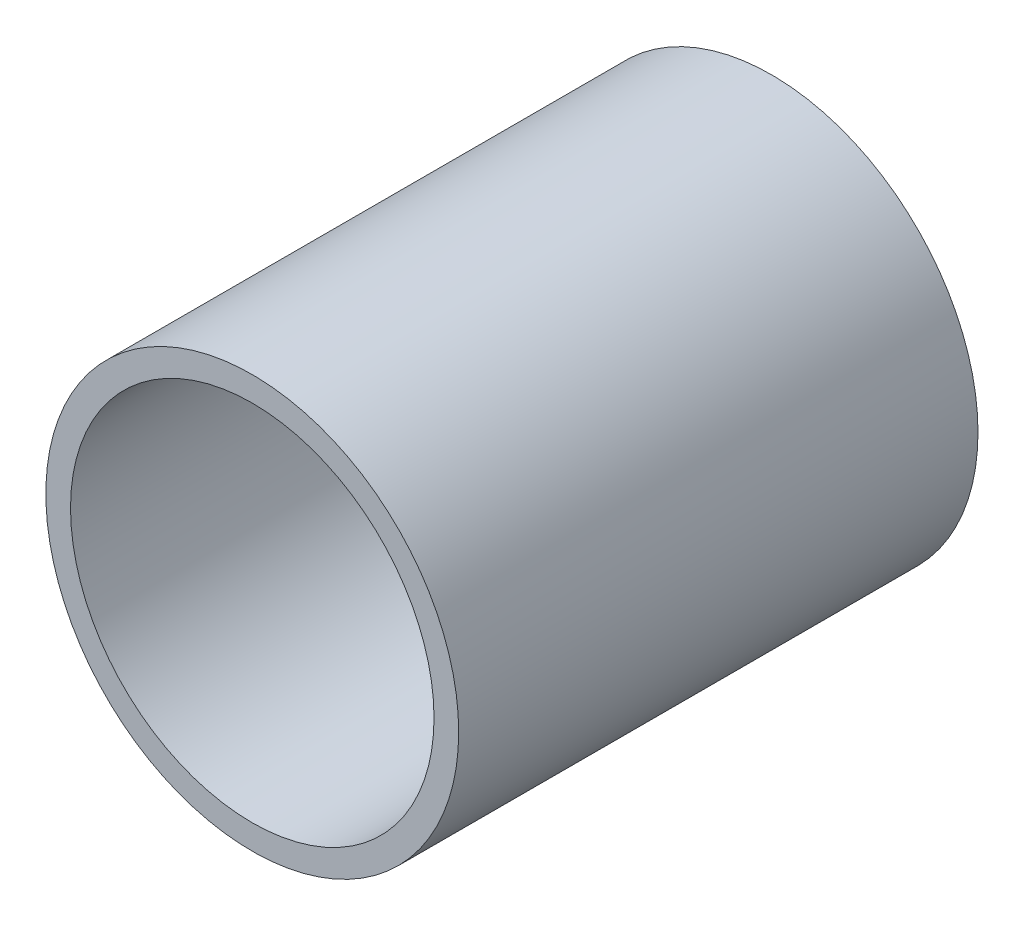
ISO-10303-21;
HEADER;
FILE_DESCRIPTION(('STEP AP214'),'2;1');
FILE_NAME('part.step','',(''),(''),'','','');
FILE_SCHEMA(('AUTOMOTIVE_DESIGN { 1 0 10303 214 1 1 1 1 }'));
ENDSEC;
DATA;
#1=APPLICATION_CONTEXT('core data for automotive mechanical design processes');
#2=APPLICATION_PROTOCOL_DEFINITION('international standard','automotive_design',2000,#1);
#3=PRODUCT_CONTEXT('',#1,'mechanical');
#4=PRODUCT('Part','Part','',(#3));
#5=PRODUCT_RELATED_PRODUCT_CATEGORY('part','',(#4));
#6=PRODUCT_DEFINITION_FORMATION('','',#4);
#7=PRODUCT_DEFINITION_CONTEXT('part definition',#1,'design');
#8=PRODUCT_DEFINITION('design','',#6,#7);
#9=PRODUCT_DEFINITION_SHAPE('','',#8);
#10=(LENGTH_UNIT() NAMED_UNIT(*) SI_UNIT(.MILLI.,.METRE.));
#11=(NAMED_UNIT(*) PLANE_ANGLE_UNIT() SI_UNIT($,.RADIAN.));
#12=(NAMED_UNIT(*) SI_UNIT($,.STERADIAN.) SOLID_ANGLE_UNIT());
#13=UNCERTAINTY_MEASURE_WITH_UNIT(LENGTH_MEASURE(1.E-05),#10,'distance_accuracy_value','');
#14=(GEOMETRIC_REPRESENTATION_CONTEXT(3) GLOBAL_UNCERTAINTY_ASSIGNED_CONTEXT((#13)) GLOBAL_UNIT_ASSIGNED_CONTEXT((#10,
#11,#12)) REPRESENTATION_CONTEXT('',''));
#15=CARTESIAN_POINT('',(0.,0.,0.));
#16=DIRECTION('',(0.,0.,1.));
#17=DIRECTION('',(1.,0.,0.));
#18=AXIS2_PLACEMENT_3D('',#15,#16,#17);
#19=CARTESIAN_POINT('',(0.,0.,20.));
#20=DIRECTION('',(0.,0.,1.));
#21=DIRECTION('',(1.,0.,0.));
#22=AXIS2_PLACEMENT_3D('',#19,#20,#21);
#23=PLANE('',#22);
#24=CARTESIAN_POINT('',(0.,0.,20.));
#25=DIRECTION('',(0.,0.,1.));
#26=DIRECTION('',(1.,0.,0.));
#27=AXIS2_PLACEMENT_3D('',#24,#25,#26);
#28=CIRCLE('',#27,7.95);
#29=CARTESIAN_POINT('',(7.95,0.,20.));
#30=VERTEX_POINT('',#29);
#31=EDGE_CURVE('E10',#30,#30,#28,.T.);
#32=ORIENTED_EDGE('',*,*,#31,.T.);
#33=EDGE_LOOP('',(#32));
#34=FACE_BOUND('',#33,.T.);
#35=CARTESIAN_POINT('',(0.,0.,20.));
#36=DIRECTION('',(0.,0.,1.));
#37=DIRECTION('',(1.,0.,0.));
#38=AXIS2_PLACEMENT_3D('',#35,#36,#37);
#39=CIRCLE('',#38,7.);
#40=CARTESIAN_POINT('',(7.,0.,20.));
#41=VERTEX_POINT('',#40);
#42=EDGE_CURVE('E41',#41,#41,#39,.T.);
#43=ORIENTED_EDGE('',*,*,#42,.F.);
#44=EDGE_LOOP('',(#43));
#45=FACE_BOUND('',#44,.T.);
#46=ADVANCED_FACE('F30',(#34,#45),#23,.T.);
#47=CARTESIAN_POINT('',(0.,0.,0.));
#48=DIRECTION('',(0.,0.,1.));
#49=DIRECTION('',(1.,0.,0.));
#50=AXIS2_PLACEMENT_3D('',#47,#48,#49);
#51=PLANE('',#50);
#52=CARTESIAN_POINT('',(0.,0.,0.));
#53=DIRECTION('',(0.,0.,1.));
#54=DIRECTION('',(1.,0.,0.));
#55=AXIS2_PLACEMENT_3D('',#52,#53,#54);
#56=CIRCLE('',#55,7.95);
#57=CARTESIAN_POINT('',(7.95,0.,0.));
#58=VERTEX_POINT('',#57);
#59=EDGE_CURVE('E34',#58,#58,#56,.T.);
#60=ORIENTED_EDGE('',*,*,#59,.F.);
#61=EDGE_LOOP('',(#60));
#62=FACE_BOUND('',#61,.T.);
#63=CARTESIAN_POINT('',(0.,0.,0.));
#64=DIRECTION('',(0.,0.,1.));
#65=DIRECTION('',(1.,0.,0.));
#66=AXIS2_PLACEMENT_3D('',#63,#64,#65);
#67=CIRCLE('',#66,7.);
#68=CARTESIAN_POINT('',(7.,0.,0.));
#69=VERTEX_POINT('',#68);
#70=EDGE_CURVE('E43',#69,#69,#67,.T.);
#71=ORIENTED_EDGE('',*,*,#70,.T.);
#72=EDGE_LOOP('',(#71));
#73=FACE_BOUND('',#72,.T.);
#74=ADVANCED_FACE('F53',(#62,#73),#51,.F.);
#75=CARTESIAN_POINT('',(0.,0.,20.));
#76=DIRECTION('',(0.,0.,-1.));
#77=DIRECTION('',(-1.,0.,0.));
#78=AXIS2_PLACEMENT_3D('',#75,#76,#77);
#79=CYLINDRICAL_SURFACE('',#78,7.95);
#80=ORIENTED_EDGE('',*,*,#31,.F.);
#81=EDGE_LOOP('',(#80));
#82=FACE_BOUND('',#81,.T.);
#83=ORIENTED_EDGE('',*,*,#59,.T.);
#84=EDGE_LOOP('',(#83));
#85=FACE_BOUND('',#84,.T.);
#86=ADVANCED_FACE('F32',(#82,#85),#79,.T.);
#87=CARTESIAN_POINT('',(0.,0.,20.));
#88=DIRECTION('',(0.,0.,-1.));
#89=DIRECTION('',(-1.,0.,0.));
#90=AXIS2_PLACEMENT_3D('',#87,#88,#89);
#91=CYLINDRICAL_SURFACE('',#90,7.);
#92=ORIENTED_EDGE('',*,*,#42,.T.);
#93=EDGE_LOOP('',(#92));
#94=FACE_BOUND('',#93,.T.);
#95=ORIENTED_EDGE('',*,*,#70,.F.);
#96=EDGE_LOOP('',(#95));
#97=FACE_BOUND('',#96,.T.);
#98=ADVANCED_FACE('F49',(#94,#97),#91,.F.);
#99=CLOSED_SHELL('',(#46,#74,#86,#98));
#100=MANIFOLD_SOLID_BREP('B2',#99);
#101=ADVANCED_BREP_SHAPE_REPRESENTATION('',(#18,#100),#14);
#102=SHAPE_DEFINITION_REPRESENTATION(#9,#101);
ENDSEC;
END-ISO-10303-21;
